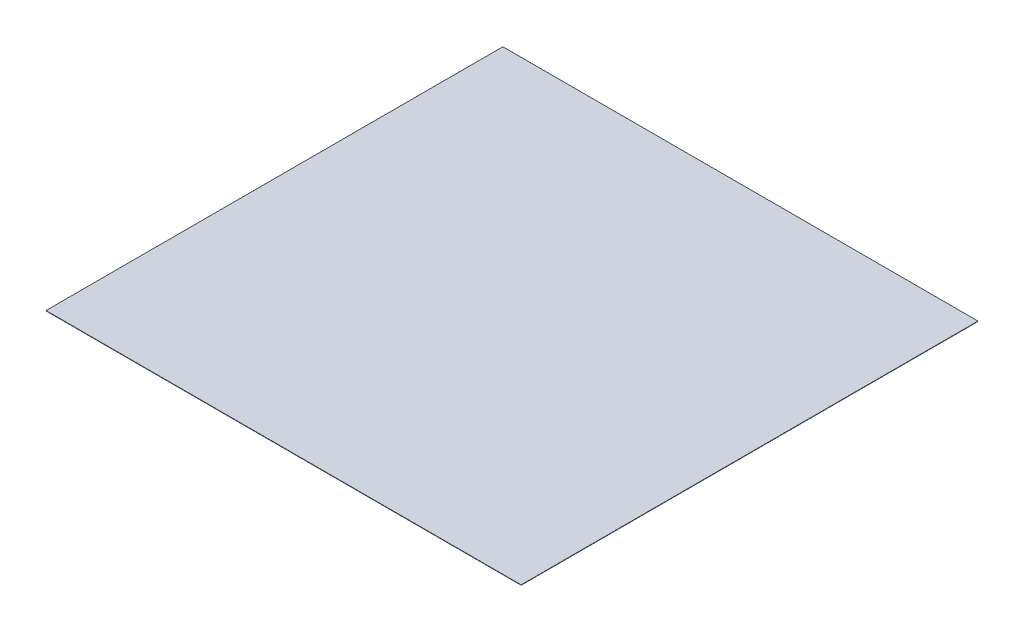
ISO-10303-21;
HEADER;
FILE_DESCRIPTION(('STEP AP214'),'2;1');
FILE_NAME('part.step','',(''),(''),'','','');
FILE_SCHEMA(('AUTOMOTIVE_DESIGN { 1 0 10303 214 1 1 1 1 }'));
ENDSEC;
DATA;
#1=APPLICATION_CONTEXT('core data for automotive mechanical design processes');
#2=APPLICATION_PROTOCOL_DEFINITION('international standard','automotive_design',2000,#1);
#3=PRODUCT_CONTEXT('',#1,'mechanical');
#4=PRODUCT('Part','Part','',(#3));
#5=PRODUCT_RELATED_PRODUCT_CATEGORY('part','',(#4));
#6=PRODUCT_DEFINITION_FORMATION('','',#4);
#7=PRODUCT_DEFINITION_CONTEXT('part definition',#1,'design');
#8=PRODUCT_DEFINITION('design','',#6,#7);
#9=PRODUCT_DEFINITION_SHAPE('','',#8);
#10=(LENGTH_UNIT() NAMED_UNIT(*) SI_UNIT(.MILLI.,.METRE.));
#11=(NAMED_UNIT(*) PLANE_ANGLE_UNIT() SI_UNIT($,.RADIAN.));
#12=(NAMED_UNIT(*) SI_UNIT($,.STERADIAN.) SOLID_ANGLE_UNIT());
#13=UNCERTAINTY_MEASURE_WITH_UNIT(LENGTH_MEASURE(1.E-05),#10,'distance_accuracy_value','');
#14=(GEOMETRIC_REPRESENTATION_CONTEXT(3) GLOBAL_UNCERTAINTY_ASSIGNED_CONTEXT((#13)) GLOBAL_UNIT_ASSIGNED_CONTEXT((#10,
#11,#12)) REPRESENTATION_CONTEXT('',''));
#15=CARTESIAN_POINT('',(0.,0.,0.));
#16=DIRECTION('',(0.,0.,1.));
#17=DIRECTION('',(1.,0.,0.));
#18=AXIS2_PLACEMENT_3D('',#15,#16,#17);
#19=CARTESIAN_POINT('',(0.,0.2,0.));
#20=DIRECTION('',(1.,0.,0.));
#21=DIRECTION('',(0.,0.,-1.));
#22=AXIS2_PLACEMENT_3D('',#19,#20,#21);
#23=PLANE('',#22);
#24=DIRECTION('',(0.,0.,1.));
#25=VECTOR('',#24,1.);
#26=CARTESIAN_POINT('',(0.,0.,0.));
#27=LINE('',#26,#25);
#28=CARTESIAN_POINT('',(0.,0.,-250.));
#29=VERTEX_POINT('',#28);
#30=CARTESIAN_POINT('',(0.,0.,0.));
#31=VERTEX_POINT('',#30);
#32=EDGE_CURVE('E98',#29,#31,#27,.T.);
#33=ORIENTED_EDGE('',*,*,#32,.T.);
#34=DIRECTION('',(0.,-1.,0.));
#35=VECTOR('',#34,1.);
#36=CARTESIAN_POINT('',(0.,0.2,0.));
#37=LINE('',#36,#35);
#38=CARTESIAN_POINT('',(0.,0.2,0.));
#39=VERTEX_POINT('',#38);
#40=EDGE_CURVE('E11',#39,#31,#37,.T.);
#41=ORIENTED_EDGE('',*,*,#40,.F.);
#42=DIRECTION('',(0.,0.,1.));
#43=VECTOR('',#42,1.);
#44=CARTESIAN_POINT('',(0.,0.2,0.));
#45=LINE('',#44,#43);
#46=CARTESIAN_POINT('',(0.,0.2,-250.));
#47=VERTEX_POINT('',#46);
#48=EDGE_CURVE('E86',#47,#39,#45,.T.);
#49=ORIENTED_EDGE('',*,*,#48,.F.);
#50=DIRECTION('',(0.,-1.,0.));
#51=VECTOR('',#50,1.);
#52=CARTESIAN_POINT('',(0.,0.2,-250.));
#53=LINE('',#52,#51);
#54=EDGE_CURVE('E94',#47,#29,#53,.T.);
#55=ORIENTED_EDGE('',*,*,#54,.T.);
#56=EDGE_LOOP('',(#33,#41,#49,#55));
#57=FACE_BOUND('',#56,.T.);
#58=ADVANCED_FACE('F35',(#57),#23,.F.);
#59=CARTESIAN_POINT('',(0.,0.2,0.));
#60=DIRECTION('',(0.,0.,-1.));
#61=DIRECTION('',(-1.,0.,0.));
#62=AXIS2_PLACEMENT_3D('',#59,#60,#61);
#63=PLANE('',#62);
#64=DIRECTION('',(1.,0.,0.));
#65=VECTOR('',#64,1.);
#66=CARTESIAN_POINT('',(0.,0.,0.));
#67=LINE('',#66,#65);
#68=CARTESIAN_POINT('',(260.,0.,0.));
#69=VERTEX_POINT('',#68);
#70=EDGE_CURVE('E90',#31,#69,#67,.T.);
#71=ORIENTED_EDGE('',*,*,#70,.T.);
#72=DIRECTION('',(0.,-1.,0.));
#73=VECTOR('',#72,1.);
#74=CARTESIAN_POINT('',(260.,0.2,0.));
#75=LINE('',#74,#73);
#76=CARTESIAN_POINT('',(260.,0.2,0.));
#77=VERTEX_POINT('',#76);
#78=EDGE_CURVE('E43',#77,#69,#75,.T.);
#79=ORIENTED_EDGE('',*,*,#78,.F.);
#80=DIRECTION('',(1.,0.,0.));
#81=VECTOR('',#80,1.);
#82=CARTESIAN_POINT('',(0.,0.2,0.));
#83=LINE('',#82,#81);
#84=EDGE_CURVE('E81',#39,#77,#83,.T.);
#85=ORIENTED_EDGE('',*,*,#84,.F.);
#86=ORIENTED_EDGE('',*,*,#40,.T.);
#87=EDGE_LOOP('',(#71,#79,#85,#86));
#88=FACE_BOUND('',#87,.T.);
#89=ADVANCED_FACE('F89',(#88),#63,.F.);
#90=CARTESIAN_POINT('',(260.,0.2,0.));
#91=DIRECTION('',(-1.,0.,0.));
#92=DIRECTION('',(0.,0.,1.));
#93=AXIS2_PLACEMENT_3D('',#90,#91,#92);
#94=PLANE('',#93);
#95=DIRECTION('',(0.,0.,-1.));
#96=VECTOR('',#95,1.);
#97=CARTESIAN_POINT('',(260.,0.,0.));
#98=LINE('',#97,#96);
#99=CARTESIAN_POINT('',(260.,0.,-250.));
#100=VERTEX_POINT('',#99);
#101=EDGE_CURVE('E68',#69,#100,#98,.T.);
#102=ORIENTED_EDGE('',*,*,#101,.T.);
#103=DIRECTION('',(0.,-1.,0.));
#104=VECTOR('',#103,1.);
#105=CARTESIAN_POINT('',(260.,0.2,-250.));
#106=LINE('',#105,#104);
#107=CARTESIAN_POINT('',(260.,0.2,-250.));
#108=VERTEX_POINT('',#107);
#109=EDGE_CURVE('E91',#108,#100,#106,.T.);
#110=ORIENTED_EDGE('',*,*,#109,.F.);
#111=DIRECTION('',(0.,0.,-1.));
#112=VECTOR('',#111,1.);
#113=CARTESIAN_POINT('',(260.,0.2,0.));
#114=LINE('',#113,#112);
#115=EDGE_CURVE('E84',#77,#108,#114,.T.);
#116=ORIENTED_EDGE('',*,*,#115,.F.);
#117=ORIENTED_EDGE('',*,*,#78,.T.);
#118=EDGE_LOOP('',(#102,#110,#116,#117));
#119=FACE_BOUND('',#118,.T.);
#120=ADVANCED_FACE('F92',(#119),#94,.F.);
#121=CARTESIAN_POINT('',(0.,0.2,-250.));
#122=DIRECTION('',(0.,0.,1.));
#123=DIRECTION('',(1.,0.,0.));
#124=AXIS2_PLACEMENT_3D('',#121,#122,#123);
#125=PLANE('',#124);
#126=DIRECTION('',(-1.,0.,0.));
#127=VECTOR('',#126,1.);
#128=CARTESIAN_POINT('',(0.,0.,-250.));
#129=LINE('',#128,#127);
#130=EDGE_CURVE('E74',#100,#29,#129,.T.);
#131=ORIENTED_EDGE('',*,*,#130,.T.);
#132=ORIENTED_EDGE('',*,*,#54,.F.);
#133=DIRECTION('',(-1.,0.,0.));
#134=VECTOR('',#133,1.);
#135=CARTESIAN_POINT('',(0.,0.2,-250.));
#136=LINE('',#135,#134);
#137=EDGE_CURVE('E51',#108,#47,#136,.T.);
#138=ORIENTED_EDGE('',*,*,#137,.F.);
#139=ORIENTED_EDGE('',*,*,#109,.T.);
#140=EDGE_LOOP('',(#131,#132,#138,#139));
#141=FACE_BOUND('',#140,.T.);
#142=ADVANCED_FACE('F105',(#141),#125,.F.);
#143=CARTESIAN_POINT('',(0.,0.2,0.));
#144=DIRECTION('',(0.,-1.,0.));
#145=DIRECTION('',(0.,0.,-1.));
#146=AXIS2_PLACEMENT_3D('',#143,#144,#145);
#147=PLANE('',#146);
#148=ORIENTED_EDGE('',*,*,#48,.T.);
#149=ORIENTED_EDGE('',*,*,#84,.T.);
#150=ORIENTED_EDGE('',*,*,#115,.T.);
#151=ORIENTED_EDGE('',*,*,#137,.T.);
#152=EDGE_LOOP('',(#148,#149,#150,#151));
#153=FACE_BOUND('',#152,.T.);
#154=ADVANCED_FACE('F82',(#153),#147,.F.);
#155=CARTESIAN_POINT('',(0.,0.,0.));
#156=DIRECTION('',(0.,-1.,0.));
#157=DIRECTION('',(0.,0.,-1.));
#158=AXIS2_PLACEMENT_3D('',#155,#156,#157);
#159=PLANE('',#158);
#160=ORIENTED_EDGE('',*,*,#32,.F.);
#161=ORIENTED_EDGE('',*,*,#130,.F.);
#162=ORIENTED_EDGE('',*,*,#101,.F.);
#163=ORIENTED_EDGE('',*,*,#70,.F.);
#164=EDGE_LOOP('',(#160,#161,#162,#163));
#165=FACE_BOUND('',#164,.T.);
#166=ADVANCED_FACE('F108',(#165),#159,.T.);
#167=CLOSED_SHELL('',(#58,#89,#120,#142,#154,#166));
#168=MANIFOLD_SOLID_BREP('B2',#167);
#169=ADVANCED_BREP_SHAPE_REPRESENTATION('',(#18,#168),#14);
#170=SHAPE_DEFINITION_REPRESENTATION(#9,#169);
ENDSEC;
END-ISO-10303-21;
